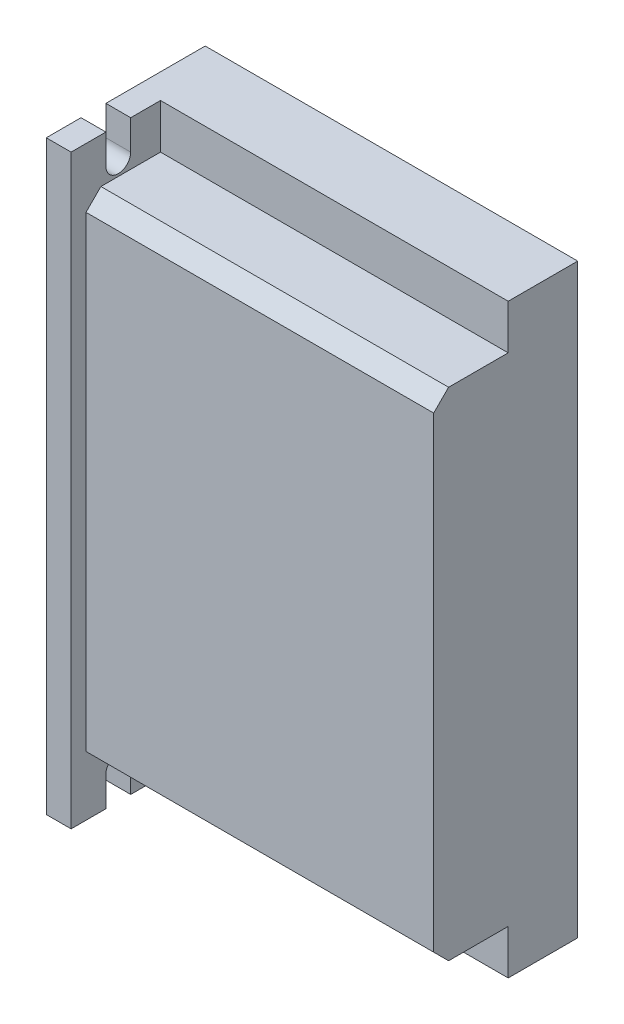
ISO-10303-21;
HEADER;
FILE_DESCRIPTION(('STEP AP214'),'2;1');
FILE_NAME('part.step','',(''),(''),'','','');
FILE_SCHEMA(('AUTOMOTIVE_DESIGN { 1 0 10303 214 1 1 1 1 }'));
ENDSEC;
DATA;
#1=APPLICATION_CONTEXT('core data for automotive mechanical design processes');
#2=APPLICATION_PROTOCOL_DEFINITION('international standard','automotive_design',2000,#1);
#3=PRODUCT_CONTEXT('',#1,'mechanical');
#4=PRODUCT('Part','Part','',(#3));
#5=PRODUCT_RELATED_PRODUCT_CATEGORY('part','',(#4));
#6=PRODUCT_DEFINITION_FORMATION('','',#4);
#7=PRODUCT_DEFINITION_CONTEXT('part definition',#1,'design');
#8=PRODUCT_DEFINITION('design','',#6,#7);
#9=PRODUCT_DEFINITION_SHAPE('','',#8);
#10=(LENGTH_UNIT() NAMED_UNIT(*) SI_UNIT(.MILLI.,.METRE.));
#11=(NAMED_UNIT(*) PLANE_ANGLE_UNIT() SI_UNIT($,.RADIAN.));
#12=(NAMED_UNIT(*) SI_UNIT($,.STERADIAN.) SOLID_ANGLE_UNIT());
#13=UNCERTAINTY_MEASURE_WITH_UNIT(LENGTH_MEASURE(1.E-05),#10,'distance_accuracy_value','');
#14=(GEOMETRIC_REPRESENTATION_CONTEXT(3) GLOBAL_UNCERTAINTY_ASSIGNED_CONTEXT((#13)) GLOBAL_UNIT_ASSIGNED_CONTEXT((#10,
#11,#12)) REPRESENTATION_CONTEXT('',''));
#15=CARTESIAN_POINT('',(0.,0.,0.));
#16=DIRECTION('',(0.,0.,1.));
#17=DIRECTION('',(1.,0.,0.));
#18=AXIS2_PLACEMENT_3D('',#15,#16,#17);
#19=CARTESIAN_POINT('',(0.,0.,18.));
#20=DIRECTION('',(0.,1.,0.));
#21=DIRECTION('',(0.,0.,1.));
#22=AXIS2_PLACEMENT_3D('',#19,#20,#21);
#23=PLANE('',#22);
#24=DIRECTION('',(0.,0.,-1.));
#25=VECTOR('',#24,1.);
#26=CARTESIAN_POINT('',(75.,0.,18.));
#27=LINE('',#26,#25);
#28=CARTESIAN_POINT('',(75.,0.,12.));
#29=VERTEX_POINT('',#28);
#30=CARTESIAN_POINT('',(75.,0.,0.));
#31=VERTEX_POINT('',#30);
#32=EDGE_CURVE('E292',#29,#31,#27,.T.);
#33=ORIENTED_EDGE('',*,*,#32,.F.);
#34=DIRECTION('',(-1.,0.,0.));
#35=VECTOR('',#34,1.);
#36=CARTESIAN_POINT('',(5.,0.,12.));
#37=LINE('',#36,#35);
#38=CARTESIAN_POINT('',(5.,0.,12.));
#39=VERTEX_POINT('',#38);
#40=EDGE_CURVE('E58',#29,#39,#37,.T.);
#41=ORIENTED_EDGE('',*,*,#40,.T.);
#42=DIRECTION('',(0.,0.,1.));
#43=VECTOR('',#42,1.);
#44=CARTESIAN_POINT('',(5.,0.,18.));
#45=LINE('',#44,#43);
#46=CARTESIAN_POINT('',(5.,0.,0.));
#47=VERTEX_POINT('',#46);
#48=EDGE_CURVE('E248',#47,#39,#45,.T.);
#49=ORIENTED_EDGE('',*,*,#48,.F.);
#50=DIRECTION('',(1.,0.,0.));
#51=VECTOR('',#50,1.);
#52=CARTESIAN_POINT('',(0.,0.,0.));
#53=LINE('',#52,#51);
#54=EDGE_CURVE('E281',#47,#31,#53,.T.);
#55=ORIENTED_EDGE('',*,*,#54,.T.);
#56=EDGE_LOOP('',(#33,#41,#49,#55));
#57=FACE_BOUND('',#56,.T.);
#58=ADVANCED_FACE('F36',(#57),#23,.F.);
#59=CARTESIAN_POINT('',(0.,100.,18.));
#60=DIRECTION('',(0.,-1.,0.));
#61=DIRECTION('',(0.,0.,-1.));
#62=AXIS2_PLACEMENT_3D('',#59,#60,#61);
#63=PLANE('',#62);
#64=DIRECTION('',(0.,0.,-1.));
#65=VECTOR('',#64,1.);
#66=CARTESIAN_POINT('',(5.,100.,18.));
#67=LINE('',#66,#65);
#68=CARTESIAN_POINT('',(5.,100.,12.));
#69=VERTEX_POINT('',#68);
#70=CARTESIAN_POINT('',(5.,100.,0.));
#71=VERTEX_POINT('',#70);
#72=EDGE_CURVE('E244',#69,#71,#67,.T.);
#73=ORIENTED_EDGE('',*,*,#72,.F.);
#74=DIRECTION('',(1.,0.,0.));
#75=VECTOR('',#74,1.);
#76=CARTESIAN_POINT('',(75.,100.,12.));
#77=LINE('',#76,#75);
#78=CARTESIAN_POINT('',(75.,100.,12.));
#79=VERTEX_POINT('',#78);
#80=EDGE_CURVE('E322',#69,#79,#77,.T.);
#81=ORIENTED_EDGE('',*,*,#80,.T.);
#82=DIRECTION('',(0.,0.,-1.));
#83=VECTOR('',#82,1.);
#84=CARTESIAN_POINT('',(75.,100.,18.));
#85=LINE('',#84,#83);
#86=CARTESIAN_POINT('',(75.,100.,0.));
#87=VERTEX_POINT('',#86);
#88=EDGE_CURVE('E285',#79,#87,#85,.T.);
#89=ORIENTED_EDGE('',*,*,#88,.T.);
#90=DIRECTION('',(-1.,0.,0.));
#91=VECTOR('',#90,1.);
#92=CARTESIAN_POINT('',(0.,100.,0.));
#93=LINE('',#92,#91);
#94=EDGE_CURVE('E286',#87,#71,#93,.T.);
#95=ORIENTED_EDGE('',*,*,#94,.T.);
#96=EDGE_LOOP('',(#73,#81,#89,#95));
#97=FACE_BOUND('',#96,.T.);
#98=ADVANCED_FACE('F364',(#97),#63,.F.);
#99=CARTESIAN_POINT('',(75.,0.,18.));
#100=DIRECTION('',(-1.,0.,0.));
#101=DIRECTION('',(0.,0.,1.));
#102=AXIS2_PLACEMENT_3D('',#99,#100,#101);
#103=PLANE('',#102);
#104=DIRECTION('',(0.,1.,0.));
#105=VECTOR('',#104,1.);
#106=CARTESIAN_POINT('',(75.,100.,15.));
#107=LINE('',#106,#105);
#108=CARTESIAN_POINT('',(75.,3.00000000000002,15.));
#109=VERTEX_POINT('',#108);
#110=CARTESIAN_POINT('',(75.,97.,15.));
#111=VERTEX_POINT('',#110);
#112=EDGE_CURVE('E209',#109,#111,#107,.T.);
#113=ORIENTED_EDGE('',*,*,#112,.F.);
#114=DIRECTION('',(0.,-0.707106781186546,-0.707106781186549));
#115=VECTOR('',#114,1.);
#116=CARTESIAN_POINT('',(75.,3.00000000000002,15.));
#117=LINE('',#116,#115);
#118=EDGE_CURVE('E319',#109,#29,#117,.T.);
#119=ORIENTED_EDGE('',*,*,#118,.T.);
#120=ORIENTED_EDGE('',*,*,#32,.T.);
#121=DIRECTION('',(0.,-1.,0.));
#122=VECTOR('',#121,1.);
#123=CARTESIAN_POINT('',(75.,109.,0.));
#124=LINE('',#123,#122);
#125=CARTESIAN_POINT('',(75.,-8.99999999999999,0.));
#126=VERTEX_POINT('',#125);
#127=EDGE_CURVE('E250',#31,#126,#124,.T.);
#128=ORIENTED_EDGE('',*,*,#127,.T.);
#129=DIRECTION('',(0.,0.,1.));
#130=VECTOR('',#129,1.);
#131=CARTESIAN_POINT('',(75.,-8.99999999999999,-14.));
#132=LINE('',#131,#130);
#133=CARTESIAN_POINT('',(75.,-8.99999999999999,-14.));
#134=VERTEX_POINT('',#133);
#135=EDGE_CURVE('E278',#134,#126,#132,.T.);
#136=ORIENTED_EDGE('',*,*,#135,.F.);
#137=DIRECTION('',(0.,-1.,0.));
#138=VECTOR('',#137,1.);
#139=CARTESIAN_POINT('',(75.,109.,-14.));
#140=LINE('',#139,#138);
#141=CARTESIAN_POINT('',(75.,109.,-14.));
#142=VERTEX_POINT('',#141);
#143=EDGE_CURVE('E251',#142,#134,#140,.T.);
#144=ORIENTED_EDGE('',*,*,#143,.F.);
#145=DIRECTION('',(0.,0.,1.));
#146=VECTOR('',#145,1.);
#147=CARTESIAN_POINT('',(75.,109.,-14.));
#148=LINE('',#147,#146);
#149=CARTESIAN_POINT('',(75.,109.,0.));
#150=VERTEX_POINT('',#149);
#151=EDGE_CURVE('E261',#142,#150,#148,.T.);
#152=ORIENTED_EDGE('',*,*,#151,.T.);
#153=EDGE_CURVE('E262',#150,#87,#124,.T.);
#154=ORIENTED_EDGE('',*,*,#153,.T.);
#155=ORIENTED_EDGE('',*,*,#88,.F.);
#156=DIRECTION('',(0.,-0.707106781186546,0.707106781186549));
#157=VECTOR('',#156,1.);
#158=CARTESIAN_POINT('',(75.,97.,15.));
#159=LINE('',#158,#157);
#160=EDGE_CURVE('E317',#79,#111,#159,.T.);
#161=ORIENTED_EDGE('',*,*,#160,.T.);
#162=EDGE_LOOP('',(#113,#119,#120,#128,#136,#144,#152,#154,#155,#161));
#163=FACE_BOUND('',#162,.T.);
#164=ADVANCED_FACE('F337',(#163),#103,.F.);
#165=CARTESIAN_POINT('',(75.,-8.99999999999999,-14.));
#166=DIRECTION('',(0.,1.,0.));
#167=DIRECTION('',(0.,0.,1.));
#168=AXIS2_PLACEMENT_3D('',#165,#166,#167);
#169=PLANE('',#168);
#170=DIRECTION('',(0.,0.,1.));
#171=VECTOR('',#170,1.);
#172=CARTESIAN_POINT('',(5.,-8.99999999999999,0.));
#173=LINE('',#172,#171);
#174=CARTESIAN_POINT('',(5.,-8.99999999999999,0.));
#175=VERTEX_POINT('',#174);
#176=CARTESIAN_POINT('',(5.,-8.99999999999999,6.));
#177=VERTEX_POINT('',#176);
#178=EDGE_CURVE('E231',#175,#177,#173,.T.);
#179=ORIENTED_EDGE('',*,*,#178,.T.);
#180=DIRECTION('',(-1.,0.,0.));
#181=VECTOR('',#180,1.);
#182=CARTESIAN_POINT('',(75.,-8.99999999999999,6.));
#183=LINE('',#182,#181);
#184=CARTESIAN_POINT('',(0.,-9.,6.));
#185=VERTEX_POINT('',#184);
#186=EDGE_CURVE('E224',#177,#185,#183,.T.);
#187=ORIENTED_EDGE('',*,*,#186,.T.);
#188=DIRECTION('',(0.,0.,1.));
#189=VECTOR('',#188,1.);
#190=CARTESIAN_POINT('',(0.,-8.99999999999999,-14.));
#191=LINE('',#190,#189);
#192=CARTESIAN_POINT('',(0.,-8.99999999999999,-14.));
#193=VERTEX_POINT('',#192);
#194=EDGE_CURVE('E275',#193,#185,#191,.T.);
#195=ORIENTED_EDGE('',*,*,#194,.F.);
#196=DIRECTION('',(-1.,0.,0.));
#197=VECTOR('',#196,1.);
#198=CARTESIAN_POINT('',(75.,-8.99999999999999,-14.));
#199=LINE('',#198,#197);
#200=EDGE_CURVE('E254',#134,#193,#199,.T.);
#201=ORIENTED_EDGE('',*,*,#200,.F.);
#202=ORIENTED_EDGE('',*,*,#135,.T.);
#203=DIRECTION('',(-1.,0.,0.));
#204=VECTOR('',#203,1.);
#205=CARTESIAN_POINT('',(75.,-8.99999999999999,0.));
#206=LINE('',#205,#204);
#207=EDGE_CURVE('E265',#126,#175,#206,.T.);
#208=ORIENTED_EDGE('',*,*,#207,.T.);
#209=EDGE_LOOP('',(#179,#187,#195,#201,#202,#208));
#210=FACE_BOUND('',#209,.T.);
#211=ADVANCED_FACE('F347',(#210),#169,.F.);
#212=CARTESIAN_POINT('',(75.,109.,-14.));
#213=DIRECTION('',(0.,-1.,0.));
#214=DIRECTION('',(0.,0.,-1.));
#215=AXIS2_PLACEMENT_3D('',#212,#213,#214);
#216=PLANE('',#215);
#217=DIRECTION('',(0.,0.,-1.));
#218=VECTOR('',#217,1.);
#219=CARTESIAN_POINT('',(5.,109.,0.));
#220=LINE('',#219,#218);
#221=CARTESIAN_POINT('',(5.,109.,18.));
#222=VERTEX_POINT('',#221);
#223=CARTESIAN_POINT('',(5.,109.,11.));
#224=VERTEX_POINT('',#223);
#225=EDGE_CURVE('E237',#222,#224,#220,.T.);
#226=ORIENTED_EDGE('',*,*,#225,.T.);
#227=DIRECTION('',(-1.,0.,0.));
#228=VECTOR('',#227,1.);
#229=CARTESIAN_POINT('',(75.,109.,11.));
#230=LINE('',#229,#228);
#231=CARTESIAN_POINT('',(0.,109.,11.));
#232=VERTEX_POINT('',#231);
#233=EDGE_CURVE('E218',#224,#232,#230,.T.);
#234=ORIENTED_EDGE('',*,*,#233,.T.);
#235=DIRECTION('',(0.,0.,1.));
#236=VECTOR('',#235,1.);
#237=CARTESIAN_POINT('',(0.,109.,-14.));
#238=LINE('',#237,#236);
#239=CARTESIAN_POINT('',(0.,109.,18.));
#240=VERTEX_POINT('',#239);
#241=EDGE_CURVE('E271',#232,#240,#238,.T.);
#242=ORIENTED_EDGE('',*,*,#241,.T.);
#243=DIRECTION('',(-1.,0.,0.));
#244=VECTOR('',#243,1.);
#245=CARTESIAN_POINT('',(5.,109.,18.));
#246=LINE('',#245,#244);
#247=EDGE_CURVE('E241',#222,#240,#246,.T.);
#248=ORIENTED_EDGE('',*,*,#247,.F.);
#249=EDGE_LOOP('',(#226,#234,#242,#248));
#250=FACE_BOUND('',#249,.T.);
#251=ADVANCED_FACE('F398',(#250),#216,.F.);
#252=CARTESIAN_POINT('',(0.,0.,0.));
#253=DIRECTION('',(0.,0.,-1.));
#254=DIRECTION('',(-1.,0.,0.));
#255=AXIS2_PLACEMENT_3D('',#252,#253,#254);
#256=PLANE('',#255);
#257=DIRECTION('',(0.,-1.,0.));
#258=VECTOR('',#257,1.);
#259=CARTESIAN_POINT('',(5.,109.,0.));
#260=LINE('',#259,#258);
#261=CARTESIAN_POINT('',(5.,109.,0.));
#262=VERTEX_POINT('',#261);
#263=EDGE_CURVE('E227',#262,#71,#260,.T.);
#264=ORIENTED_EDGE('',*,*,#263,.T.);
#265=ORIENTED_EDGE('',*,*,#94,.F.);
#266=ORIENTED_EDGE('',*,*,#153,.F.);
#267=DIRECTION('',(1.,0.,0.));
#268=VECTOR('',#267,1.);
#269=CARTESIAN_POINT('',(75.,109.,0.));
#270=LINE('',#269,#268);
#271=EDGE_CURVE('E255',#262,#150,#270,.T.);
#272=ORIENTED_EDGE('',*,*,#271,.F.);
#273=EDGE_LOOP('',(#264,#265,#266,#272));
#274=FACE_BOUND('',#273,.T.);
#275=ADVANCED_FACE('F361',(#274),#256,.F.);
#276=DIRECTION('',(0.,1.,0.));
#277=VECTOR('',#276,1.);
#278=CARTESIAN_POINT('',(5.,0.,0.));
#279=LINE('',#278,#277);
#280=EDGE_CURVE('E294',#175,#47,#279,.T.);
#281=ORIENTED_EDGE('',*,*,#280,.F.);
#282=ORIENTED_EDGE('',*,*,#207,.F.);
#283=ORIENTED_EDGE('',*,*,#127,.F.);
#284=ORIENTED_EDGE('',*,*,#54,.F.);
#285=EDGE_LOOP('',(#281,#282,#283,#284));
#286=FACE_BOUND('',#285,.T.);
#287=ADVANCED_FACE('F343',(#286),#256,.F.);
#288=CARTESIAN_POINT('',(0.,0.,18.));
#289=DIRECTION('',(1.,0.,0.));
#290=DIRECTION('',(0.,0.,-1.));
#291=AXIS2_PLACEMENT_3D('',#288,#289,#290);
#292=PLANE('',#291);
#293=ORIENTED_EDGE('',*,*,#241,.F.);
#294=DIRECTION('',(0.,1.,0.));
#295=VECTOR('',#294,1.);
#296=CARTESIAN_POINT('',(0.,114.734094434726,11.));
#297=LINE('',#296,#295);
#298=CARTESIAN_POINT('',(0.,103.,11.));
#299=VERTEX_POINT('',#298);
#300=EDGE_CURVE('E186',#299,#232,#297,.T.);
#301=ORIENTED_EDGE('',*,*,#300,.F.);
#302=CARTESIAN_POINT('',(0.,103.,8.5));
#303=DIRECTION('',(-1.,0.,0.));
#304=DIRECTION('',(0.,0.,1.));
#305=AXIS2_PLACEMENT_3D('',#302,#303,#304);
#306=CIRCLE('',#305,2.5);
#307=CARTESIAN_POINT('',(0.,103.,6.));
#308=VERTEX_POINT('',#307);
#309=EDGE_CURVE('E179',#308,#299,#306,.T.);
#310=ORIENTED_EDGE('',*,*,#309,.F.);
#311=DIRECTION('',(0.,-1.,0.));
#312=VECTOR('',#311,1.);
#313=CARTESIAN_POINT('',(0.,114.734094434726,6.));
#314=LINE('',#313,#312);
#315=CARTESIAN_POINT('',(0.,109.,6.));
#316=VERTEX_POINT('',#315);
#317=EDGE_CURVE('E189',#316,#308,#314,.T.);
#318=ORIENTED_EDGE('',*,*,#317,.F.);
#319=CARTESIAN_POINT('',(0.,109.,-14.));
#320=VERTEX_POINT('',#319);
#321=EDGE_CURVE('E272',#320,#316,#238,.T.);
#322=ORIENTED_EDGE('',*,*,#321,.F.);
#323=DIRECTION('',(0.,1.,0.));
#324=VECTOR('',#323,1.);
#325=CARTESIAN_POINT('',(0.,109.,-14.));
#326=LINE('',#325,#324);
#327=EDGE_CURVE('E257',#193,#320,#326,.T.);
#328=ORIENTED_EDGE('',*,*,#327,.F.);
#329=ORIENTED_EDGE('',*,*,#194,.T.);
#330=DIRECTION('',(0.,-1.,0.));
#331=VECTOR('',#330,1.);
#332=CARTESIAN_POINT('',(0.,-14.7340944347265,6.));
#333=LINE('',#332,#331);
#334=CARTESIAN_POINT('',(0.,-3.,6.));
#335=VERTEX_POINT('',#334);
#336=EDGE_CURVE('E212',#335,#185,#333,.T.);
#337=ORIENTED_EDGE('',*,*,#336,.F.);
#338=CARTESIAN_POINT('',(0.,-3.,8.5));
#339=DIRECTION('',(-1.,0.,0.));
#340=DIRECTION('',(0.,0.,-1.));
#341=AXIS2_PLACEMENT_3D('',#338,#339,#340);
#342=CIRCLE('',#341,2.5);
#343=CARTESIAN_POINT('',(0.,-3.,11.));
#344=VERTEX_POINT('',#343);
#345=EDGE_CURVE('E208',#344,#335,#342,.T.);
#346=ORIENTED_EDGE('',*,*,#345,.F.);
#347=DIRECTION('',(0.,1.,0.));
#348=VECTOR('',#347,1.);
#349=CARTESIAN_POINT('',(0.,-14.7340944347265,11.));
#350=LINE('',#349,#348);
#351=CARTESIAN_POINT('',(0.,-9.,11.));
#352=VERTEX_POINT('',#351);
#353=EDGE_CURVE('E205',#352,#344,#350,.T.);
#354=ORIENTED_EDGE('',*,*,#353,.F.);
#355=CARTESIAN_POINT('',(0.,-8.99999999999999,18.));
#356=VERTEX_POINT('',#355);
#357=EDGE_CURVE('E274',#352,#356,#191,.T.);
#358=ORIENTED_EDGE('',*,*,#357,.T.);
#359=DIRECTION('',(0.,-1.,0.));
#360=VECTOR('',#359,1.);
#361=CARTESIAN_POINT('',(0.,0.,18.));
#362=LINE('',#361,#360);
#363=EDGE_CURVE('E282',#240,#356,#362,.T.);
#364=ORIENTED_EDGE('',*,*,#363,.F.);
#365=EDGE_LOOP('',(#293,#301,#310,#318,#322,#328,#329,#337,#346,#354,#358,#364));
#366=FACE_BOUND('',#365,.T.);
#367=ADVANCED_FACE('F199',(#366),#292,.F.);
#368=CARTESIAN_POINT('',(0.,0.,18.));
#369=DIRECTION('',(0.,0.,-1.));
#370=DIRECTION('',(-1.,0.,0.));
#371=AXIS2_PLACEMENT_3D('',#368,#369,#370);
#372=PLANE('',#371);
#373=DIRECTION('',(0.,1.,0.));
#374=VECTOR('',#373,1.);
#375=CARTESIAN_POINT('',(5.,109.,18.));
#376=LINE('',#375,#374);
#377=CARTESIAN_POINT('',(5.,-8.99999999999999,18.));
#378=VERTEX_POINT('',#377);
#379=EDGE_CURVE('E234',#378,#222,#376,.T.);
#380=ORIENTED_EDGE('',*,*,#379,.T.);
#381=ORIENTED_EDGE('',*,*,#247,.T.);
#382=ORIENTED_EDGE('',*,*,#363,.T.);
#383=DIRECTION('',(-1.,0.,0.));
#384=VECTOR('',#383,1.);
#385=CARTESIAN_POINT('',(5.,-8.99999999999999,18.));
#386=LINE('',#385,#384);
#387=EDGE_CURVE('E240',#378,#356,#386,.T.);
#388=ORIENTED_EDGE('',*,*,#387,.F.);
#389=EDGE_LOOP('',(#380,#381,#382,#388));
#390=FACE_BOUND('',#389,.T.);
#391=ADVANCED_FACE('F381',(#390),#372,.F.);
#392=ORIENTED_EDGE('',*,*,#357,.F.);
#393=DIRECTION('',(1.,0.,0.));
#394=VECTOR('',#393,1.);
#395=CARTESIAN_POINT('',(75.,-8.99999999999999,11.));
#396=LINE('',#395,#394);
#397=CARTESIAN_POINT('',(5.,-8.99999999999999,11.));
#398=VERTEX_POINT('',#397);
#399=EDGE_CURVE('E221',#352,#398,#396,.T.);
#400=ORIENTED_EDGE('',*,*,#399,.T.);
#401=EDGE_CURVE('E230',#398,#378,#173,.T.);
#402=ORIENTED_EDGE('',*,*,#401,.T.);
#403=ORIENTED_EDGE('',*,*,#387,.T.);
#404=EDGE_LOOP('',(#392,#400,#402,#403));
#405=FACE_BOUND('',#404,.T.);
#406=ADVANCED_FACE('F391',(#405),#169,.F.);
#407=ORIENTED_EDGE('',*,*,#321,.T.);
#408=DIRECTION('',(1.,0.,0.));
#409=VECTOR('',#408,1.);
#410=CARTESIAN_POINT('',(75.,109.,6.));
#411=LINE('',#410,#409);
#412=CARTESIAN_POINT('',(5.,109.,6.));
#413=VERTEX_POINT('',#412);
#414=EDGE_CURVE('E192',#316,#413,#411,.T.);
#415=ORIENTED_EDGE('',*,*,#414,.T.);
#416=EDGE_CURVE('E236',#413,#262,#220,.T.);
#417=ORIENTED_EDGE('',*,*,#416,.T.);
#418=ORIENTED_EDGE('',*,*,#271,.T.);
#419=ORIENTED_EDGE('',*,*,#151,.F.);
#420=DIRECTION('',(1.,0.,0.));
#421=VECTOR('',#420,1.);
#422=CARTESIAN_POINT('',(75.,109.,-14.));
#423=LINE('',#422,#421);
#424=EDGE_CURVE('E259',#320,#142,#423,.T.);
#425=ORIENTED_EDGE('',*,*,#424,.F.);
#426=EDGE_LOOP('',(#407,#415,#417,#418,#419,#425));
#427=FACE_BOUND('',#426,.T.);
#428=ADVANCED_FACE('F355',(#427),#216,.F.);
#429=CARTESIAN_POINT('',(0.,0.,-14.));
#430=DIRECTION('',(0.,0.,-1.));
#431=DIRECTION('',(-1.,0.,0.));
#432=AXIS2_PLACEMENT_3D('',#429,#430,#431);
#433=PLANE('',#432);
#434=ORIENTED_EDGE('',*,*,#143,.T.);
#435=ORIENTED_EDGE('',*,*,#200,.T.);
#436=ORIENTED_EDGE('',*,*,#327,.T.);
#437=ORIENTED_EDGE('',*,*,#424,.T.);
#438=EDGE_LOOP('',(#434,#435,#436,#437));
#439=FACE_BOUND('',#438,.T.);
#440=ADVANCED_FACE('F351',(#439),#433,.T.);
#441=CARTESIAN_POINT('',(5.,0.,0.));
#442=DIRECTION('',(-1.,0.,0.));
#443=DIRECTION('',(0.,0.,1.));
#444=AXIS2_PLACEMENT_3D('',#441,#442,#443);
#445=PLANE('',#444);
#446=CARTESIAN_POINT('',(5.,-3.,8.5));
#447=DIRECTION('',(-1.,0.,0.));
#448=DIRECTION('',(0.,0.,1.));
#449=AXIS2_PLACEMENT_3D('',#446,#447,#448);
#450=CIRCLE('',#449,2.5);
#451=CARTESIAN_POINT('',(5.,-3.,11.));
#452=VERTEX_POINT('',#451);
#453=CARTESIAN_POINT('',(5.,-3.,6.));
#454=VERTEX_POINT('',#453);
#455=EDGE_CURVE('E305',#452,#454,#450,.T.);
#456=ORIENTED_EDGE('',*,*,#455,.T.);
#457=DIRECTION('',(0.,-1.,0.));
#458=VECTOR('',#457,1.);
#459=CARTESIAN_POINT('',(5.,0.,6.));
#460=LINE('',#459,#458);
#461=EDGE_CURVE('E308',#454,#177,#460,.T.);
#462=ORIENTED_EDGE('',*,*,#461,.T.);
#463=ORIENTED_EDGE('',*,*,#178,.F.);
#464=ORIENTED_EDGE('',*,*,#280,.T.);
#465=ORIENTED_EDGE('',*,*,#48,.T.);
#466=DIRECTION('',(0.,0.707106781186546,0.707106781186549));
#467=VECTOR('',#466,1.);
#468=CARTESIAN_POINT('',(5.,-5.99999999999998,5.99999999999995));
#469=LINE('',#468,#467);
#470=CARTESIAN_POINT('',(5.,3.00000000000002,15.));
#471=VERTEX_POINT('',#470);
#472=EDGE_CURVE('E45',#39,#471,#469,.T.);
#473=ORIENTED_EDGE('',*,*,#472,.T.);
#474=DIRECTION('',(0.,-1.,0.));
#475=VECTOR('',#474,1.);
#476=CARTESIAN_POINT('',(5.,100.,15.));
#477=LINE('',#476,#475);
#478=CARTESIAN_POINT('',(5.,97.,15.));
#479=VERTEX_POINT('',#478);
#480=EDGE_CURVE('E326',#479,#471,#477,.T.);
#481=ORIENTED_EDGE('',*,*,#480,.F.);
#482=DIRECTION('',(0.,0.707106781186546,-0.707106781186549));
#483=VECTOR('',#482,1.);
#484=CARTESIAN_POINT('',(5.,56.0000000000002,56.));
#485=LINE('',#484,#483);
#486=EDGE_CURVE('E11',#479,#69,#485,.T.);
#487=ORIENTED_EDGE('',*,*,#486,.T.);
#488=ORIENTED_EDGE('',*,*,#72,.T.);
#489=ORIENTED_EDGE('',*,*,#263,.F.);
#490=ORIENTED_EDGE('',*,*,#416,.F.);
#491=DIRECTION('',(0.,-1.,0.));
#492=VECTOR('',#491,1.);
#493=CARTESIAN_POINT('',(5.,0.,6.00000000000002));
#494=LINE('',#493,#492);
#495=CARTESIAN_POINT('',(5.,103.,6.));
#496=VERTEX_POINT('',#495);
#497=EDGE_CURVE('E296',#413,#496,#494,.T.);
#498=ORIENTED_EDGE('',*,*,#497,.T.);
#499=CARTESIAN_POINT('',(5.,103.,8.5));
#500=DIRECTION('',(-1.,0.,0.));
#501=DIRECTION('',(0.,0.,1.));
#502=AXIS2_PLACEMENT_3D('',#499,#500,#501);
#503=CIRCLE('',#502,2.5);
#504=CARTESIAN_POINT('',(5.,103.,11.));
#505=VERTEX_POINT('',#504);
#506=EDGE_CURVE('E182',#496,#505,#503,.T.);
#507=ORIENTED_EDGE('',*,*,#506,.T.);
#508=DIRECTION('',(0.,1.,0.));
#509=VECTOR('',#508,1.);
#510=CARTESIAN_POINT('',(5.,0.,11.));
#511=LINE('',#510,#509);
#512=EDGE_CURVE('E299',#505,#224,#511,.T.);
#513=ORIENTED_EDGE('',*,*,#512,.T.);
#514=ORIENTED_EDGE('',*,*,#225,.F.);
#515=ORIENTED_EDGE('',*,*,#379,.F.);
#516=ORIENTED_EDGE('',*,*,#401,.F.);
#517=DIRECTION('',(0.,1.,0.));
#518=VECTOR('',#517,1.);
#519=CARTESIAN_POINT('',(5.,0.,11.));
#520=LINE('',#519,#518);
#521=EDGE_CURVE('E302',#398,#452,#520,.T.);
#522=ORIENTED_EDGE('',*,*,#521,.T.);
#523=EDGE_LOOP('',(#456,#462,#463,#464,#465,#473,#481,#487,#488,#489,#490,#498,#507,#513,#514,
#515,#516,#522));
#524=FACE_BOUND('',#523,.T.);
#525=ADVANCED_FACE('F325',(#524),#445,.F.);
#526=CARTESIAN_POINT('',(75.,114.734094434726,11.));
#527=DIRECTION('',(0.,0.,1.));
#528=DIRECTION('',(1.,0.,0.));
#529=AXIS2_PLACEMENT_3D('',#526,#527,#528);
#530=PLANE('',#529);
#531=ORIENTED_EDGE('',*,*,#512,.F.);
#532=DIRECTION('',(-1.,0.,0.));
#533=VECTOR('',#532,1.);
#534=CARTESIAN_POINT('',(75.,103.,11.));
#535=LINE('',#534,#533);
#536=EDGE_CURVE('E185',#505,#299,#535,.T.);
#537=ORIENTED_EDGE('',*,*,#536,.T.);
#538=ORIENTED_EDGE('',*,*,#300,.T.);
#539=ORIENTED_EDGE('',*,*,#233,.F.);
#540=EDGE_LOOP('',(#531,#537,#538,#539));
#541=FACE_BOUND('',#540,.T.);
#542=ADVANCED_FACE('F485',(#541),#530,.F.);
#543=CARTESIAN_POINT('',(75.,103.,8.5));
#544=DIRECTION('',(-1.,0.,0.));
#545=DIRECTION('',(0.,0.,1.));
#546=AXIS2_PLACEMENT_3D('',#543,#544,#545);
#547=CYLINDRICAL_SURFACE('',#546,2.5);
#548=DIRECTION('',(-1.,0.,0.));
#549=VECTOR('',#548,1.);
#550=CARTESIAN_POINT('',(75.,103.,6.));
#551=LINE('',#550,#549);
#552=EDGE_CURVE('E174',#496,#308,#551,.T.);
#553=ORIENTED_EDGE('',*,*,#552,.T.);
#554=ORIENTED_EDGE('',*,*,#309,.T.);
#555=ORIENTED_EDGE('',*,*,#536,.F.);
#556=ORIENTED_EDGE('',*,*,#506,.F.);
#557=EDGE_LOOP('',(#553,#554,#555,#556));
#558=FACE_BOUND('',#557,.T.);
#559=ADVANCED_FACE('F176',(#558),#547,.F.);
#560=CARTESIAN_POINT('',(75.,114.734094434726,6.));
#561=DIRECTION('',(0.,0.,-1.));
#562=DIRECTION('',(0.,1.,0.));
#563=AXIS2_PLACEMENT_3D('',#560,#561,#562);
#564=PLANE('',#563);
#565=ORIENTED_EDGE('',*,*,#317,.T.);
#566=ORIENTED_EDGE('',*,*,#552,.F.);
#567=ORIENTED_EDGE('',*,*,#497,.F.);
#568=ORIENTED_EDGE('',*,*,#414,.F.);
#569=EDGE_LOOP('',(#565,#566,#567,#568));
#570=FACE_BOUND('',#569,.T.);
#571=ADVANCED_FACE('F190',(#570),#564,.F.);
#572=CARTESIAN_POINT('',(75.,-14.7340944347265,6.));
#573=DIRECTION('',(0.,0.,-1.));
#574=DIRECTION('',(0.,1.,0.));
#575=AXIS2_PLACEMENT_3D('',#572,#573,#574);
#576=PLANE('',#575);
#577=ORIENTED_EDGE('',*,*,#461,.F.);
#578=DIRECTION('',(-1.,0.,0.));
#579=VECTOR('',#578,1.);
#580=CARTESIAN_POINT('',(75.,-3.,6.));
#581=LINE('',#580,#579);
#582=EDGE_CURVE('E196',#454,#335,#581,.T.);
#583=ORIENTED_EDGE('',*,*,#582,.T.);
#584=ORIENTED_EDGE('',*,*,#336,.T.);
#585=ORIENTED_EDGE('',*,*,#186,.F.);
#586=EDGE_LOOP('',(#577,#583,#584,#585));
#587=FACE_BOUND('',#586,.T.);
#588=ADVANCED_FACE('F458',(#587),#576,.F.);
#589=CARTESIAN_POINT('',(75.,-3.,8.5));
#590=DIRECTION('',(-1.,0.,0.));
#591=DIRECTION('',(0.,0.,1.));
#592=AXIS2_PLACEMENT_3D('',#589,#590,#591);
#593=CYLINDRICAL_SURFACE('',#592,2.5);
#594=DIRECTION('',(-1.,0.,0.));
#595=VECTOR('',#594,1.);
#596=CARTESIAN_POINT('',(75.,-3.,11.));
#597=LINE('',#596,#595);
#598=EDGE_CURVE('E214',#452,#344,#597,.T.);
#599=ORIENTED_EDGE('',*,*,#598,.T.);
#600=ORIENTED_EDGE('',*,*,#345,.T.);
#601=ORIENTED_EDGE('',*,*,#582,.F.);
#602=ORIENTED_EDGE('',*,*,#455,.F.);
#603=EDGE_LOOP('',(#599,#600,#601,#602));
#604=FACE_BOUND('',#603,.T.);
#605=ADVANCED_FACE('F446',(#604),#593,.F.);
#606=CARTESIAN_POINT('',(75.,-14.7340944347265,11.));
#607=DIRECTION('',(0.,0.,1.));
#608=DIRECTION('',(1.,0.,0.));
#609=AXIS2_PLACEMENT_3D('',#606,#607,#608);
#610=PLANE('',#609);
#611=ORIENTED_EDGE('',*,*,#353,.T.);
#612=ORIENTED_EDGE('',*,*,#598,.F.);
#613=ORIENTED_EDGE('',*,*,#521,.F.);
#614=ORIENTED_EDGE('',*,*,#399,.F.);
#615=EDGE_LOOP('',(#611,#612,#613,#614));
#616=FACE_BOUND('',#615,.T.);
#617=ADVANCED_FACE('F441',(#616),#610,.F.);
#618=CARTESIAN_POINT('',(0.,0.,15.));
#619=DIRECTION('',(0.,0.,1.));
#620=DIRECTION('',(1.,0.,0.));
#621=AXIS2_PLACEMENT_3D('',#618,#619,#620);
#622=PLANE('',#621);
#623=ORIENTED_EDGE('',*,*,#480,.T.);
#624=DIRECTION('',(1.,0.,0.));
#625=VECTOR('',#624,1.);
#626=CARTESIAN_POINT('',(75.,3.00000000000002,15.));
#627=LINE('',#626,#625);
#628=EDGE_CURVE('E314',#471,#109,#627,.T.);
#629=ORIENTED_EDGE('',*,*,#628,.T.);
#630=ORIENTED_EDGE('',*,*,#112,.T.);
#631=DIRECTION('',(-1.,0.,0.));
#632=VECTOR('',#631,1.);
#633=CARTESIAN_POINT('',(5.,97.,15.));
#634=LINE('',#633,#632);
#635=EDGE_CURVE('E311',#111,#479,#634,.T.);
#636=ORIENTED_EDGE('',*,*,#635,.T.);
#637=EDGE_LOOP('',(#623,#629,#630,#636));
#638=FACE_BOUND('',#637,.T.);
#639=ADVANCED_FACE('F330',(#638),#622,.T.);
#640=CARTESIAN_POINT('',(0.,3.00000000000002,15.));
#641=DIRECTION('',(0.,-0.707106781186549,0.707106781186546));
#642=DIRECTION('',(-1.,0.,0.));
#643=AXIS2_PLACEMENT_3D('',#640,#641,#642);
#644=PLANE('',#643);
#645=ORIENTED_EDGE('',*,*,#472,.F.);
#646=ORIENTED_EDGE('',*,*,#40,.F.);
#647=ORIENTED_EDGE('',*,*,#118,.F.);
#648=ORIENTED_EDGE('',*,*,#628,.F.);
#649=EDGE_LOOP('',(#645,#646,#647,#648));
#650=FACE_BOUND('',#649,.T.);
#651=ADVANCED_FACE('F335',(#650),#644,.T.);
#652=CARTESIAN_POINT('',(0.,97.,15.));
#653=DIRECTION('',(0.,0.707106781186549,0.707106781186546));
#654=DIRECTION('',(1.,0.,0.));
#655=AXIS2_PLACEMENT_3D('',#652,#653,#654);
#656=PLANE('',#655);
#657=ORIENTED_EDGE('',*,*,#160,.F.);
#658=ORIENTED_EDGE('',*,*,#80,.F.);
#659=ORIENTED_EDGE('',*,*,#486,.F.);
#660=ORIENTED_EDGE('',*,*,#635,.F.);
#661=EDGE_LOOP('',(#657,#658,#659,#660));
#662=FACE_BOUND('',#661,.T.);
#663=ADVANCED_FACE('F39',(#662),#656,.T.);
#664=CLOSED_SHELL('',(#58,#98,#164,#211,#251,#275,#287,#367,#391,#406,#428,#440,#525,#542,#559,
#571,#588,#605,#617,#639,#651,#663));
#665=MANIFOLD_SOLID_BREP('B2',#664);
#666=ADVANCED_BREP_SHAPE_REPRESENTATION('',(#18,#665),#14);
#667=SHAPE_DEFINITION_REPRESENTATION(#9,#666);
ENDSEC;
END-ISO-10303-21;
